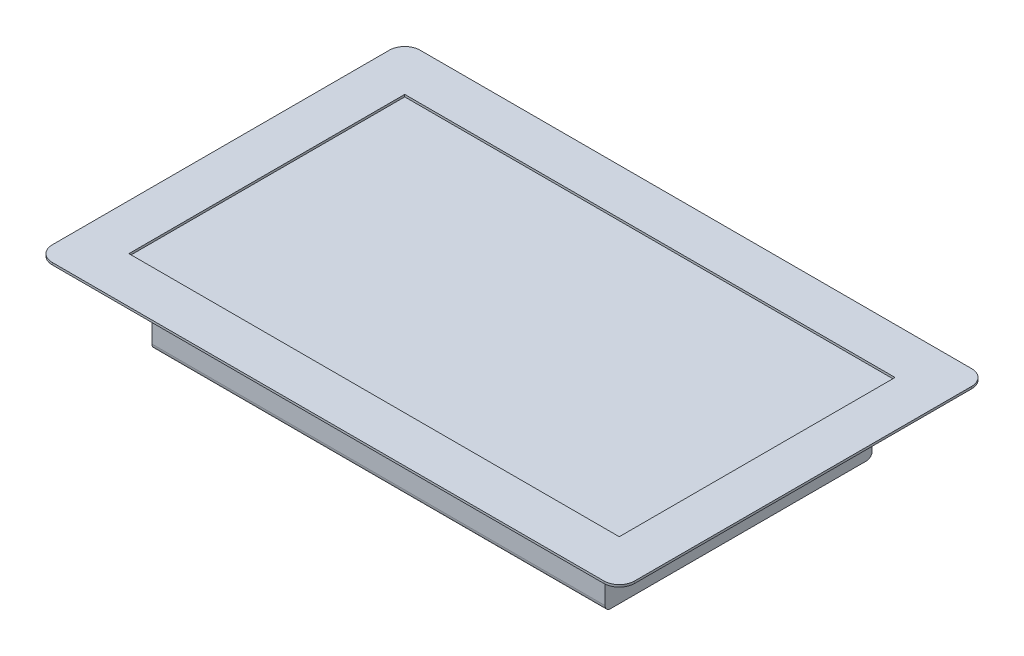
ISO-10303-21;
HEADER;
FILE_DESCRIPTION(('STEP AP214'),'2;1');
FILE_NAME('part.step','',(''),(''),'','','');
FILE_SCHEMA(('AUTOMOTIVE_DESIGN { 1 0 10303 214 1 1 1 1 }'));
ENDSEC;
DATA;
#1=APPLICATION_CONTEXT('core data for automotive mechanical design processes');
#2=APPLICATION_PROTOCOL_DEFINITION('international standard','automotive_design',2000,#1);
#3=PRODUCT_CONTEXT('',#1,'mechanical');
#4=PRODUCT('Part','Part','',(#3));
#5=PRODUCT_RELATED_PRODUCT_CATEGORY('part','',(#4));
#6=PRODUCT_DEFINITION_FORMATION('','',#4);
#7=PRODUCT_DEFINITION_CONTEXT('part definition',#1,'design');
#8=PRODUCT_DEFINITION('design','',#6,#7);
#9=PRODUCT_DEFINITION_SHAPE('','',#8);
#10=(LENGTH_UNIT() NAMED_UNIT(*) SI_UNIT(.MILLI.,.METRE.));
#11=(NAMED_UNIT(*) PLANE_ANGLE_UNIT() SI_UNIT($,.RADIAN.));
#12=(NAMED_UNIT(*) SI_UNIT($,.STERADIAN.) SOLID_ANGLE_UNIT());
#13=UNCERTAINTY_MEASURE_WITH_UNIT(LENGTH_MEASURE(1.E-05),#10,'distance_accuracy_value','');
#14=(GEOMETRIC_REPRESENTATION_CONTEXT(3) GLOBAL_UNCERTAINTY_ASSIGNED_CONTEXT((#13)) GLOBAL_UNIT_ASSIGNED_CONTEXT((#10,
#11,#12)) REPRESENTATION_CONTEXT('',''));
#15=CARTESIAN_POINT('',(0.,0.,0.));
#16=DIRECTION('',(0.,0.,1.));
#17=DIRECTION('',(1.,0.,0.));
#18=AXIS2_PLACEMENT_3D('',#15,#16,#17);
#19=CARTESIAN_POINT('',(0.,-7.,0.));
#20=DIRECTION('',(0.,-1.,0.));
#21=DIRECTION('',(0.,0.,-1.));
#22=AXIS2_PLACEMENT_3D('',#19,#20,#21);
#23=PLANE('',#22);
#24=DIRECTION('',(1.,0.,0.));
#25=VECTOR('',#24,1.);
#26=CARTESIAN_POINT('',(123.5,-7.,74.5));
#27=LINE('',#26,#25);
#28=CARTESIAN_POINT('',(-122.5,-7.,74.5));
#29=VERTEX_POINT('',#28);
#30=CARTESIAN_POINT('',(122.5,-7.,74.5));
#31=VERTEX_POINT('',#30);
#32=EDGE_CURVE('E355',#29,#31,#27,.T.);
#33=ORIENTED_EDGE('',*,*,#32,.F.);
#34=CARTESIAN_POINT('',(-122.5,-7.,73.5));
#35=DIRECTION('',(0.,-1.,0.));
#36=DIRECTION('',(0.,0.,-1.));
#37=AXIS2_PLACEMENT_3D('',#34,#35,#36);
#38=CIRCLE('',#37,1.);
#39=CARTESIAN_POINT('',(-123.5,-7.,73.5));
#40=VERTEX_POINT('',#39);
#41=EDGE_CURVE('E451',#29,#40,#38,.T.);
#42=ORIENTED_EDGE('',*,*,#41,.T.);
#43=DIRECTION('',(0.,0.,1.));
#44=VECTOR('',#43,1.);
#45=CARTESIAN_POINT('',(-123.5,-7.,-74.5));
#46=LINE('',#45,#44);
#47=CARTESIAN_POINT('',(-123.5,-7.,-73.5));
#48=VERTEX_POINT('',#47);
#49=EDGE_CURVE('E352',#48,#40,#46,.T.);
#50=ORIENTED_EDGE('',*,*,#49,.F.);
#51=CARTESIAN_POINT('',(-122.5,-7.,-73.5));
#52=DIRECTION('',(0.,-1.,0.));
#53=DIRECTION('',(0.,0.,-1.));
#54=AXIS2_PLACEMENT_3D('',#51,#52,#53);
#55=CIRCLE('',#54,1.);
#56=CARTESIAN_POINT('',(-122.5,-7.,-74.5));
#57=VERTEX_POINT('',#56);
#58=EDGE_CURVE('E449',#48,#57,#55,.T.);
#59=ORIENTED_EDGE('',*,*,#58,.T.);
#60=DIRECTION('',(-1.,0.,0.));
#61=VECTOR('',#60,1.);
#62=CARTESIAN_POINT('',(123.5,-7.,-74.5));
#63=LINE('',#62,#61);
#64=CARTESIAN_POINT('',(122.5,-7.,-74.5));
#65=VERTEX_POINT('',#64);
#66=EDGE_CURVE('E362',#65,#57,#63,.T.);
#67=ORIENTED_EDGE('',*,*,#66,.F.);
#68=CARTESIAN_POINT('',(122.5,-7.,-73.5));
#69=DIRECTION('',(0.,-1.,0.));
#70=DIRECTION('',(0.,0.,-1.));
#71=AXIS2_PLACEMENT_3D('',#68,#69,#70);
#72=CIRCLE('',#71,1.);
#73=CARTESIAN_POINT('',(123.5,-7.,-73.5));
#74=VERTEX_POINT('',#73);
#75=EDGE_CURVE('E445',#65,#74,#72,.T.);
#76=ORIENTED_EDGE('',*,*,#75,.T.);
#77=DIRECTION('',(0.,0.,-1.));
#78=VECTOR('',#77,1.);
#79=CARTESIAN_POINT('',(123.5,-7.,-74.5));
#80=LINE('',#79,#78);
#81=CARTESIAN_POINT('',(123.5,-7.,73.5));
#82=VERTEX_POINT('',#81);
#83=EDGE_CURVE('E359',#82,#74,#80,.T.);
#84=ORIENTED_EDGE('',*,*,#83,.F.);
#85=CARTESIAN_POINT('',(122.5,-7.,73.5));
#86=DIRECTION('',(0.,-1.,0.));
#87=DIRECTION('',(0.,0.,-1.));
#88=AXIS2_PLACEMENT_3D('',#85,#86,#87);
#89=CIRCLE('',#88,1.);
#90=EDGE_CURVE('E447',#82,#31,#89,.T.);
#91=ORIENTED_EDGE('',*,*,#90,.T.);
#92=EDGE_LOOP('',(#33,#42,#50,#59,#67,#76,#84,#91));
#93=FACE_BOUND('',#92,.T.);
#94=DIRECTION('',(0.,0.,1.));
#95=VECTOR('',#94,1.);
#96=CARTESIAN_POINT('',(103.5,-7.,73.));
#97=LINE('',#96,#95);
#98=CARTESIAN_POINT('',(103.5,-6.99999999999998,-70.5));
#99=VERTEX_POINT('',#98);
#100=CARTESIAN_POINT('',(103.5,-7.,70.5));
#101=VERTEX_POINT('',#100);
#102=EDGE_CURVE('E318',#99,#101,#97,.T.);
#103=ORIENTED_EDGE('',*,*,#102,.F.);
#104=CARTESIAN_POINT('',(101.,-7.,-70.5));
#105=DIRECTION('',(0.,-1.,0.));
#106=DIRECTION('',(0.,0.,-1.));
#107=AXIS2_PLACEMENT_3D('',#104,#105,#106);
#108=CIRCLE('',#107,2.5);
#109=CARTESIAN_POINT('',(101.,-6.99999999999998,-73.));
#110=VERTEX_POINT('',#109);
#111=EDGE_CURVE('E51',#99,#110,#108,.F.);
#112=ORIENTED_EDGE('',*,*,#111,.T.);
#113=DIRECTION('',(-1.,0.,0.));
#114=VECTOR('',#113,1.);
#115=CARTESIAN_POINT('',(103.5,-6.99999999999998,-73.));
#116=LINE('',#115,#114);
#117=CARTESIAN_POINT('',(-101.,-6.99999999999998,-73.));
#118=VERTEX_POINT('',#117);
#119=EDGE_CURVE('E337',#110,#118,#116,.T.);
#120=ORIENTED_EDGE('',*,*,#119,.T.);
#121=CARTESIAN_POINT('',(-101.,-7.,-70.5));
#122=DIRECTION('',(0.,-1.,0.));
#123=DIRECTION('',(0.,0.,-1.));
#124=AXIS2_PLACEMENT_3D('',#121,#122,#123);
#125=CIRCLE('',#124,2.5);
#126=CARTESIAN_POINT('',(-103.5,-6.99999999999998,-70.5));
#127=VERTEX_POINT('',#126);
#128=EDGE_CURVE('E11',#118,#127,#125,.F.);
#129=ORIENTED_EDGE('',*,*,#128,.T.);
#130=DIRECTION('',(0.,0.,1.));
#131=VECTOR('',#130,1.);
#132=CARTESIAN_POINT('',(-103.5,-7.,73.));
#133=LINE('',#132,#131);
#134=CARTESIAN_POINT('',(-103.5,-7.,70.5));
#135=VERTEX_POINT('',#134);
#136=EDGE_CURVE('E307',#127,#135,#133,.T.);
#137=ORIENTED_EDGE('',*,*,#136,.T.);
#138=CARTESIAN_POINT('',(-101.,-7.,70.5));
#139=DIRECTION('',(0.,-1.,0.));
#140=DIRECTION('',(0.,0.,-1.));
#141=AXIS2_PLACEMENT_3D('',#138,#139,#140);
#142=CIRCLE('',#141,2.5);
#143=CARTESIAN_POINT('',(-101.,-7.,73.));
#144=VERTEX_POINT('',#143);
#145=EDGE_CURVE('E516',#135,#144,#142,.F.);
#146=ORIENTED_EDGE('',*,*,#145,.T.);
#147=DIRECTION('',(-1.,0.,0.));
#148=VECTOR('',#147,1.);
#149=CARTESIAN_POINT('',(103.5,-7.,73.));
#150=LINE('',#149,#148);
#151=CARTESIAN_POINT('',(101.,-7.,73.));
#152=VERTEX_POINT('',#151);
#153=EDGE_CURVE('E321',#152,#144,#150,.T.);
#154=ORIENTED_EDGE('',*,*,#153,.F.);
#155=CARTESIAN_POINT('',(101.,-7.,70.5));
#156=DIRECTION('',(0.,-1.,0.));
#157=DIRECTION('',(0.,0.,-1.));
#158=AXIS2_PLACEMENT_3D('',#155,#156,#157);
#159=CIRCLE('',#158,2.5);
#160=EDGE_CURVE('E518',#152,#101,#159,.F.);
#161=ORIENTED_EDGE('',*,*,#160,.T.);
#162=EDGE_LOOP('',(#103,#112,#120,#129,#137,#146,#154,#161));
#163=FACE_BOUND('',#162,.T.);
#164=ADVANCED_FACE('F43',(#93,#163),#23,.T.);
#165=CARTESIAN_POINT('',(-133.,1.,84.));
#166=DIRECTION('',(1.,0.,0.));
#167=DIRECTION('',(0.,0.,-1.));
#168=AXIS2_PLACEMENT_3D('',#165,#166,#167);
#169=PLANE('',#168);
#170=DIRECTION('',(0.,0.,1.));
#171=VECTOR('',#170,1.);
#172=CARTESIAN_POINT('',(-133.,1.,84.));
#173=LINE('',#172,#171);
#174=CARTESIAN_POINT('',(-133.,1.,-77.));
#175=VERTEX_POINT('',#174);
#176=CARTESIAN_POINT('',(-133.,1.,77.));
#177=VERTEX_POINT('',#176);
#178=EDGE_CURVE('E376',#175,#177,#173,.T.);
#179=ORIENTED_EDGE('',*,*,#178,.F.);
#180=DIRECTION('',(0.,-1.,0.));
#181=VECTOR('',#180,1.);
#182=CARTESIAN_POINT('',(-133.,1.,-77.));
#183=LINE('',#182,#181);
#184=CARTESIAN_POINT('',(-133.,0.,-77.));
#185=VERTEX_POINT('',#184);
#186=EDGE_CURVE('E427',#175,#185,#183,.T.);
#187=ORIENTED_EDGE('',*,*,#186,.T.);
#188=DIRECTION('',(0.,0.,1.));
#189=VECTOR('',#188,1.);
#190=CARTESIAN_POINT('',(-133.,0.,84.));
#191=LINE('',#190,#189);
#192=CARTESIAN_POINT('',(-133.,0.,77.));
#193=VERTEX_POINT('',#192);
#194=EDGE_CURVE('E365',#185,#193,#191,.T.);
#195=ORIENTED_EDGE('',*,*,#194,.T.);
#196=DIRECTION('',(0.,-1.,0.));
#197=VECTOR('',#196,1.);
#198=CARTESIAN_POINT('',(-133.,1.,77.));
#199=LINE('',#198,#197);
#200=EDGE_CURVE('E425',#193,#177,#199,.F.);
#201=ORIENTED_EDGE('',*,*,#200,.T.);
#202=EDGE_LOOP('',(#179,#187,#195,#201));
#203=FACE_BOUND('',#202,.T.);
#204=ADVANCED_FACE('F589',(#203),#169,.F.);
#205=CARTESIAN_POINT('',(133.,1.,84.));
#206=DIRECTION('',(0.,0.,-1.));
#207=DIRECTION('',(-1.,0.,0.));
#208=AXIS2_PLACEMENT_3D('',#205,#206,#207);
#209=PLANE('',#208);
#210=DIRECTION('',(1.,0.,0.));
#211=VECTOR('',#210,1.);
#212=CARTESIAN_POINT('',(133.,1.,84.));
#213=LINE('',#212,#211);
#214=CARTESIAN_POINT('',(-126.,1.,84.));
#215=VERTEX_POINT('',#214);
#216=CARTESIAN_POINT('',(126.,1.,84.));
#217=VERTEX_POINT('',#216);
#218=EDGE_CURVE('E379',#215,#217,#213,.T.);
#219=ORIENTED_EDGE('',*,*,#218,.F.);
#220=DIRECTION('',(0.,-1.,0.));
#221=VECTOR('',#220,1.);
#222=CARTESIAN_POINT('',(-126.,1.,84.));
#223=LINE('',#222,#221);
#224=CARTESIAN_POINT('',(-126.,0.,84.));
#225=VERTEX_POINT('',#224);
#226=EDGE_CURVE('E432',#215,#225,#223,.T.);
#227=ORIENTED_EDGE('',*,*,#226,.T.);
#228=DIRECTION('',(1.,0.,0.));
#229=VECTOR('',#228,1.);
#230=CARTESIAN_POINT('',(133.,0.,84.));
#231=LINE('',#230,#229);
#232=CARTESIAN_POINT('',(126.,0.,84.));
#233=VERTEX_POINT('',#232);
#234=EDGE_CURVE('E392',#225,#233,#231,.T.);
#235=ORIENTED_EDGE('',*,*,#234,.T.);
#236=DIRECTION('',(0.,-1.,0.));
#237=VECTOR('',#236,1.);
#238=CARTESIAN_POINT('',(126.,1.,84.));
#239=LINE('',#238,#237);
#240=EDGE_CURVE('E430',#233,#217,#239,.F.);
#241=ORIENTED_EDGE('',*,*,#240,.T.);
#242=EDGE_LOOP('',(#219,#227,#235,#241));
#243=FACE_BOUND('',#242,.T.);
#244=ADVANCED_FACE('F597',(#243),#209,.F.);
#245=CARTESIAN_POINT('',(133.,1.,84.));
#246=DIRECTION('',(-1.,0.,0.));
#247=DIRECTION('',(0.,0.,1.));
#248=AXIS2_PLACEMENT_3D('',#245,#246,#247);
#249=PLANE('',#248);
#250=DIRECTION('',(0.,0.,-1.));
#251=VECTOR('',#250,1.);
#252=CARTESIAN_POINT('',(133.,0.,84.));
#253=LINE('',#252,#251);
#254=CARTESIAN_POINT('',(133.,0.,77.));
#255=VERTEX_POINT('',#254);
#256=CARTESIAN_POINT('',(133.,0.,-77.));
#257=VERTEX_POINT('',#256);
#258=EDGE_CURVE('E395',#255,#257,#253,.T.);
#259=ORIENTED_EDGE('',*,*,#258,.T.);
#260=DIRECTION('',(0.,-1.,0.));
#261=VECTOR('',#260,1.);
#262=CARTESIAN_POINT('',(133.,1.,-77.));
#263=LINE('',#262,#261);
#264=CARTESIAN_POINT('',(133.,1.,-77.));
#265=VERTEX_POINT('',#264);
#266=EDGE_CURVE('E415',#257,#265,#263,.F.);
#267=ORIENTED_EDGE('',*,*,#266,.T.);
#268=DIRECTION('',(0.,0.,-1.));
#269=VECTOR('',#268,1.);
#270=CARTESIAN_POINT('',(133.,1.,84.));
#271=LINE('',#270,#269);
#272=CARTESIAN_POINT('',(133.,1.,77.));
#273=VERTEX_POINT('',#272);
#274=EDGE_CURVE('E383',#273,#265,#271,.T.);
#275=ORIENTED_EDGE('',*,*,#274,.F.);
#276=DIRECTION('',(0.,-1.,0.));
#277=VECTOR('',#276,1.);
#278=CARTESIAN_POINT('',(133.,1.,77.));
#279=LINE('',#278,#277);
#280=EDGE_CURVE('E412',#273,#255,#279,.T.);
#281=ORIENTED_EDGE('',*,*,#280,.T.);
#282=EDGE_LOOP('',(#259,#267,#275,#281));
#283=FACE_BOUND('',#282,.T.);
#284=ADVANCED_FACE('F631',(#283),#249,.F.);
#285=CARTESIAN_POINT('',(133.,1.,-84.));
#286=DIRECTION('',(0.,0.,1.));
#287=DIRECTION('',(1.,0.,0.));
#288=AXIS2_PLACEMENT_3D('',#285,#286,#287);
#289=PLANE('',#288);
#290=DIRECTION('',(-1.,0.,0.));
#291=VECTOR('',#290,1.);
#292=CARTESIAN_POINT('',(133.,1.,-84.));
#293=LINE('',#292,#291);
#294=CARTESIAN_POINT('',(126.,1.,-84.));
#295=VERTEX_POINT('',#294);
#296=CARTESIAN_POINT('',(-126.,1.,-84.));
#297=VERTEX_POINT('',#296);
#298=EDGE_CURVE('E386',#295,#297,#293,.T.);
#299=ORIENTED_EDGE('',*,*,#298,.F.);
#300=DIRECTION('',(0.,-1.,0.));
#301=VECTOR('',#300,1.);
#302=CARTESIAN_POINT('',(126.,1.,-84.));
#303=LINE('',#302,#301);
#304=CARTESIAN_POINT('',(126.,0.,-84.));
#305=VERTEX_POINT('',#304);
#306=EDGE_CURVE('E401',#295,#305,#303,.T.);
#307=ORIENTED_EDGE('',*,*,#306,.T.);
#308=DIRECTION('',(-1.,0.,0.));
#309=VECTOR('',#308,1.);
#310=CARTESIAN_POINT('',(133.,0.,-84.));
#311=LINE('',#310,#309);
#312=CARTESIAN_POINT('',(-126.,0.,-84.));
#313=VERTEX_POINT('',#312);
#314=EDGE_CURVE('E380',#305,#313,#311,.T.);
#315=ORIENTED_EDGE('',*,*,#314,.T.);
#316=DIRECTION('',(0.,-1.,0.));
#317=VECTOR('',#316,1.);
#318=CARTESIAN_POINT('',(-126.,1.,-84.));
#319=LINE('',#318,#317);
#320=EDGE_CURVE('E389',#313,#297,#319,.F.);
#321=ORIENTED_EDGE('',*,*,#320,.T.);
#322=EDGE_LOOP('',(#299,#307,#315,#321));
#323=FACE_BOUND('',#322,.T.);
#324=ADVANCED_FACE('F624',(#323),#289,.F.);
#325=CARTESIAN_POINT('',(0.,1.,0.));
#326=DIRECTION('',(0.,1.,0.));
#327=DIRECTION('',(0.,0.,1.));
#328=AXIS2_PLACEMENT_3D('',#325,#326,#327);
#329=PLANE('',#328);
#330=DIRECTION('',(0.,0.,1.));
#331=VECTOR('',#330,1.);
#332=CARTESIAN_POINT('',(-112.,1.,63.));
#333=LINE('',#332,#331);
#334=CARTESIAN_POINT('',(-112.,1.,-63.));
#335=VERTEX_POINT('',#334);
#336=CARTESIAN_POINT('',(-112.,1.,63.));
#337=VERTEX_POINT('',#336);
#338=EDGE_CURVE('E58',#335,#337,#333,.T.);
#339=ORIENTED_EDGE('',*,*,#338,.F.);
#340=DIRECTION('',(-1.,0.,0.));
#341=VECTOR('',#340,1.);
#342=CARTESIAN_POINT('',(112.,1.,-63.));
#343=LINE('',#342,#341);
#344=CARTESIAN_POINT('',(112.,1.,-63.));
#345=VERTEX_POINT('',#344);
#346=EDGE_CURVE('E285',#345,#335,#343,.T.);
#347=ORIENTED_EDGE('',*,*,#346,.F.);
#348=DIRECTION('',(0.,0.,-1.));
#349=VECTOR('',#348,1.);
#350=CARTESIAN_POINT('',(112.,1.,63.));
#351=LINE('',#350,#349);
#352=CARTESIAN_POINT('',(112.,1.,63.));
#353=VERTEX_POINT('',#352);
#354=EDGE_CURVE('E288',#353,#345,#351,.T.);
#355=ORIENTED_EDGE('',*,*,#354,.F.);
#356=DIRECTION('',(1.,0.,0.));
#357=VECTOR('',#356,1.);
#358=CARTESIAN_POINT('',(112.,1.,63.));
#359=LINE('',#358,#357);
#360=EDGE_CURVE('E294',#337,#353,#359,.T.);
#361=ORIENTED_EDGE('',*,*,#360,.F.);
#362=EDGE_LOOP('',(#339,#347,#355,#361));
#363=FACE_BOUND('',#362,.T.);
#364=ORIENTED_EDGE('',*,*,#274,.T.);
#365=CARTESIAN_POINT('',(126.,1.,-77.));
#366=DIRECTION('',(0.,1.,0.));
#367=DIRECTION('',(0.,0.,1.));
#368=AXIS2_PLACEMENT_3D('',#365,#366,#367);
#369=CIRCLE('',#368,7.);
#370=EDGE_CURVE('E423',#265,#295,#369,.T.);
#371=ORIENTED_EDGE('',*,*,#370,.T.);
#372=ORIENTED_EDGE('',*,*,#298,.T.);
#373=CARTESIAN_POINT('',(-126.,1.,-77.));
#374=DIRECTION('',(0.,1.,0.));
#375=DIRECTION('',(0.,0.,1.));
#376=AXIS2_PLACEMENT_3D('',#373,#374,#375);
#377=CIRCLE('',#376,7.);
#378=EDGE_CURVE('E421',#297,#175,#377,.T.);
#379=ORIENTED_EDGE('',*,*,#378,.T.);
#380=ORIENTED_EDGE('',*,*,#178,.T.);
#381=CARTESIAN_POINT('',(-126.,1.,77.));
#382=DIRECTION('',(0.,1.,0.));
#383=DIRECTION('',(0.,0.,1.));
#384=AXIS2_PLACEMENT_3D('',#381,#382,#383);
#385=CIRCLE('',#384,7.);
#386=EDGE_CURVE('E419',#177,#215,#385,.T.);
#387=ORIENTED_EDGE('',*,*,#386,.T.);
#388=ORIENTED_EDGE('',*,*,#218,.T.);
#389=CARTESIAN_POINT('',(126.,1.,77.));
#390=DIRECTION('',(0.,1.,0.));
#391=DIRECTION('',(0.,0.,1.));
#392=AXIS2_PLACEMENT_3D('',#389,#390,#391);
#393=CIRCLE('',#392,7.);
#394=EDGE_CURVE('E417',#217,#273,#393,.T.);
#395=ORIENTED_EDGE('',*,*,#394,.T.);
#396=EDGE_LOOP('',(#364,#371,#372,#379,#380,#387,#388,#395));
#397=FACE_BOUND('',#396,.T.);
#398=ADVANCED_FACE('F621',(#363,#397),#329,.T.);
#399=CARTESIAN_POINT('',(0.,0.,0.));
#400=DIRECTION('',(0.,1.,0.));
#401=DIRECTION('',(0.,0.,1.));
#402=AXIS2_PLACEMENT_3D('',#399,#400,#401);
#403=PLANE('',#402);
#404=DIRECTION('',(0.,0.,-1.));
#405=VECTOR('',#404,1.);
#406=CARTESIAN_POINT('',(123.5,0.,-74.5));
#407=LINE('',#406,#405);
#408=CARTESIAN_POINT('',(123.5,0.,73.5));
#409=VERTEX_POINT('',#408);
#410=CARTESIAN_POINT('',(123.5,0.,-73.5));
#411=VERTEX_POINT('',#410);
#412=EDGE_CURVE('E371',#409,#411,#407,.T.);
#413=ORIENTED_EDGE('',*,*,#412,.T.);
#414=CARTESIAN_POINT('',(122.5,0.,-73.5));
#415=DIRECTION('',(0.,1.,0.));
#416=DIRECTION('',(0.,0.,1.));
#417=AXIS2_PLACEMENT_3D('',#414,#415,#416);
#418=CIRCLE('',#417,1.);
#419=CARTESIAN_POINT('',(122.5,0.,-74.5));
#420=VERTEX_POINT('',#419);
#421=EDGE_CURVE('E469',#411,#420,#418,.T.);
#422=ORIENTED_EDGE('',*,*,#421,.T.);
#423=DIRECTION('',(-1.,0.,0.));
#424=VECTOR('',#423,1.);
#425=CARTESIAN_POINT('',(123.5,0.,-74.5));
#426=LINE('',#425,#424);
#427=CARTESIAN_POINT('',(-122.5,0.,-74.5));
#428=VERTEX_POINT('',#427);
#429=EDGE_CURVE('E356',#420,#428,#426,.T.);
#430=ORIENTED_EDGE('',*,*,#429,.T.);
#431=CARTESIAN_POINT('',(-122.5,0.,-73.5));
#432=DIRECTION('',(0.,1.,0.));
#433=DIRECTION('',(0.,0.,1.));
#434=AXIS2_PLACEMENT_3D('',#431,#432,#433);
#435=CIRCLE('',#434,1.);
#436=CARTESIAN_POINT('',(-123.5,0.,-73.5));
#437=VERTEX_POINT('',#436);
#438=EDGE_CURVE('E465',#428,#437,#435,.T.);
#439=ORIENTED_EDGE('',*,*,#438,.T.);
#440=DIRECTION('',(0.,0.,1.));
#441=VECTOR('',#440,1.);
#442=CARTESIAN_POINT('',(-123.5,0.,-74.5));
#443=LINE('',#442,#441);
#444=CARTESIAN_POINT('',(-123.5,0.,73.5));
#445=VERTEX_POINT('',#444);
#446=EDGE_CURVE('E351',#437,#445,#443,.T.);
#447=ORIENTED_EDGE('',*,*,#446,.T.);
#448=CARTESIAN_POINT('',(-122.5,0.,73.5));
#449=DIRECTION('',(0.,1.,0.));
#450=DIRECTION('',(0.,0.,1.));
#451=AXIS2_PLACEMENT_3D('',#448,#449,#450);
#452=CIRCLE('',#451,1.);
#453=CARTESIAN_POINT('',(-122.5,0.,74.5));
#454=VERTEX_POINT('',#453);
#455=EDGE_CURVE('E463',#445,#454,#452,.T.);
#456=ORIENTED_EDGE('',*,*,#455,.T.);
#457=DIRECTION('',(1.,0.,0.));
#458=VECTOR('',#457,1.);
#459=CARTESIAN_POINT('',(123.5,0.,74.5));
#460=LINE('',#459,#458);
#461=CARTESIAN_POINT('',(122.5,0.,74.5));
#462=VERTEX_POINT('',#461);
#463=EDGE_CURVE('E368',#454,#462,#460,.T.);
#464=ORIENTED_EDGE('',*,*,#463,.T.);
#465=CARTESIAN_POINT('',(122.5,0.,73.5));
#466=DIRECTION('',(0.,1.,0.));
#467=DIRECTION('',(0.,0.,1.));
#468=AXIS2_PLACEMENT_3D('',#465,#466,#467);
#469=CIRCLE('',#468,1.);
#470=EDGE_CURVE('E467',#462,#409,#469,.T.);
#471=ORIENTED_EDGE('',*,*,#470,.T.);
#472=EDGE_LOOP('',(#413,#422,#430,#439,#447,#456,#464,#471));
#473=FACE_BOUND('',#472,.T.);
#474=ORIENTED_EDGE('',*,*,#314,.F.);
#475=CARTESIAN_POINT('',(126.,0.,-77.));
#476=DIRECTION('',(0.,1.,0.));
#477=DIRECTION('',(0.,0.,1.));
#478=AXIS2_PLACEMENT_3D('',#475,#476,#477);
#479=CIRCLE('',#478,7.);
#480=EDGE_CURVE('E410',#305,#257,#479,.F.);
#481=ORIENTED_EDGE('',*,*,#480,.T.);
#482=ORIENTED_EDGE('',*,*,#258,.F.);
#483=CARTESIAN_POINT('',(126.,0.,77.));
#484=DIRECTION('',(0.,1.,0.));
#485=DIRECTION('',(0.,0.,1.));
#486=AXIS2_PLACEMENT_3D('',#483,#484,#485);
#487=CIRCLE('',#486,7.);
#488=EDGE_CURVE('E404',#255,#233,#487,.F.);
#489=ORIENTED_EDGE('',*,*,#488,.T.);
#490=ORIENTED_EDGE('',*,*,#234,.F.);
#491=CARTESIAN_POINT('',(-126.,0.,77.));
#492=DIRECTION('',(0.,1.,0.));
#493=DIRECTION('',(0.,0.,1.));
#494=AXIS2_PLACEMENT_3D('',#491,#492,#493);
#495=CIRCLE('',#494,7.);
#496=EDGE_CURVE('E406',#225,#193,#495,.F.);
#497=ORIENTED_EDGE('',*,*,#496,.T.);
#498=ORIENTED_EDGE('',*,*,#194,.F.);
#499=CARTESIAN_POINT('',(-126.,0.,-77.));
#500=DIRECTION('',(0.,1.,0.));
#501=DIRECTION('',(0.,0.,1.));
#502=AXIS2_PLACEMENT_3D('',#499,#500,#501);
#503=CIRCLE('',#502,7.);
#504=EDGE_CURVE('E408',#185,#313,#503,.F.);
#505=ORIENTED_EDGE('',*,*,#504,.T.);
#506=EDGE_LOOP('',(#474,#481,#482,#489,#490,#497,#498,#505));
#507=FACE_BOUND('',#506,.T.);
#508=ADVANCED_FACE('F619',(#473,#507),#403,.F.);
#509=CARTESIAN_POINT('',(-123.5,-7.,-74.5));
#510=DIRECTION('',(-1.,0.,0.));
#511=DIRECTION('',(0.,0.,1.));
#512=AXIS2_PLACEMENT_3D('',#509,#510,#511);
#513=PLANE('',#512);
#514=ORIENTED_EDGE('',*,*,#49,.T.);
#515=DIRECTION('',(0.,1.,0.));
#516=VECTOR('',#515,1.);
#517=CARTESIAN_POINT('',(-123.5,-7.,73.5));
#518=LINE('',#517,#516);
#519=EDGE_CURVE('E437',#40,#445,#518,.T.);
#520=ORIENTED_EDGE('',*,*,#519,.T.);
#521=ORIENTED_EDGE('',*,*,#446,.F.);
#522=DIRECTION('',(0.,1.,0.));
#523=VECTOR('',#522,1.);
#524=CARTESIAN_POINT('',(-123.5,-7.,-73.5));
#525=LINE('',#524,#523);
#526=EDGE_CURVE('E435',#437,#48,#525,.F.);
#527=ORIENTED_EDGE('',*,*,#526,.T.);
#528=EDGE_LOOP('',(#514,#520,#521,#527));
#529=FACE_BOUND('',#528,.T.);
#530=ADVANCED_FACE('F608',(#529),#513,.T.);
#531=CARTESIAN_POINT('',(123.5,-7.,-74.5));
#532=DIRECTION('',(0.,0.,-1.));
#533=DIRECTION('',(-1.,0.,0.));
#534=AXIS2_PLACEMENT_3D('',#531,#532,#533);
#535=PLANE('',#534);
#536=ORIENTED_EDGE('',*,*,#66,.T.);
#537=DIRECTION('',(0.,1.,0.));
#538=VECTOR('',#537,1.);
#539=CARTESIAN_POINT('',(-122.5,-7.,-74.5));
#540=LINE('',#539,#538);
#541=EDGE_CURVE('E455',#57,#428,#540,.T.);
#542=ORIENTED_EDGE('',*,*,#541,.T.);
#543=ORIENTED_EDGE('',*,*,#429,.F.);
#544=DIRECTION('',(0.,1.,0.));
#545=VECTOR('',#544,1.);
#546=CARTESIAN_POINT('',(122.5,-7.,-74.5));
#547=LINE('',#546,#545);
#548=EDGE_CURVE('E453',#420,#65,#547,.F.);
#549=ORIENTED_EDGE('',*,*,#548,.T.);
#550=EDGE_LOOP('',(#536,#542,#543,#549));
#551=FACE_BOUND('',#550,.T.);
#552=ADVANCED_FACE('F604',(#551),#535,.T.);
#553=CARTESIAN_POINT('',(123.5,-7.,-74.5));
#554=DIRECTION('',(1.,0.,0.));
#555=DIRECTION('',(0.,0.,-1.));
#556=AXIS2_PLACEMENT_3D('',#553,#554,#555);
#557=PLANE('',#556);
#558=ORIENTED_EDGE('',*,*,#412,.F.);
#559=DIRECTION('',(0.,1.,0.));
#560=VECTOR('',#559,1.);
#561=CARTESIAN_POINT('',(123.5,-7.,73.5));
#562=LINE('',#561,#560);
#563=EDGE_CURVE('E461',#409,#82,#562,.F.);
#564=ORIENTED_EDGE('',*,*,#563,.T.);
#565=ORIENTED_EDGE('',*,*,#83,.T.);
#566=DIRECTION('',(0.,1.,0.));
#567=VECTOR('',#566,1.);
#568=CARTESIAN_POINT('',(123.5,-7.,-73.5));
#569=LINE('',#568,#567);
#570=EDGE_CURVE('E458',#74,#411,#569,.T.);
#571=ORIENTED_EDGE('',*,*,#570,.T.);
#572=EDGE_LOOP('',(#558,#564,#565,#571));
#573=FACE_BOUND('',#572,.T.);
#574=ADVANCED_FACE('F607',(#573),#557,.T.);
#575=CARTESIAN_POINT('',(123.5,-7.,74.5));
#576=DIRECTION('',(0.,0.,1.));
#577=DIRECTION('',(1.,0.,0.));
#578=AXIS2_PLACEMENT_3D('',#575,#576,#577);
#579=PLANE('',#578);
#580=ORIENTED_EDGE('',*,*,#463,.F.);
#581=DIRECTION('',(0.,1.,0.));
#582=VECTOR('',#581,1.);
#583=CARTESIAN_POINT('',(-122.5,-7.,74.5));
#584=LINE('',#583,#582);
#585=EDGE_CURVE('E443',#454,#29,#584,.F.);
#586=ORIENTED_EDGE('',*,*,#585,.T.);
#587=ORIENTED_EDGE('',*,*,#32,.T.);
#588=DIRECTION('',(0.,1.,0.));
#589=VECTOR('',#588,1.);
#590=CARTESIAN_POINT('',(122.5,-7.,74.5));
#591=LINE('',#590,#589);
#592=EDGE_CURVE('E440',#31,#462,#591,.T.);
#593=ORIENTED_EDGE('',*,*,#592,.T.);
#594=EDGE_LOOP('',(#580,#586,#587,#593));
#595=FACE_BOUND('',#594,.T.);
#596=ADVANCED_FACE('F612',(#595),#579,.T.);
#597=CARTESIAN_POINT('',(103.5,-8.,73.));
#598=DIRECTION('',(0.,0.,-1.));
#599=DIRECTION('',(-1.,0.,0.));
#600=AXIS2_PLACEMENT_3D('',#597,#598,#599);
#601=PLANE('',#600);
#602=ORIENTED_EDGE('',*,*,#153,.T.);
#603=DIRECTION('',(0.,-1.,0.));
#604=VECTOR('',#603,1.);
#605=CARTESIAN_POINT('',(-101.,-8.,73.));
#606=LINE('',#605,#604);
#607=CARTESIAN_POINT('',(-101.,-8.,73.));
#608=VERTEX_POINT('',#607);
#609=EDGE_CURVE('E473',#144,#608,#606,.T.);
#610=ORIENTED_EDGE('',*,*,#609,.T.);
#611=DIRECTION('',(-1.,0.,0.));
#612=VECTOR('',#611,1.);
#613=CARTESIAN_POINT('',(103.5,-8.,73.));
#614=LINE('',#613,#612);
#615=CARTESIAN_POINT('',(101.,-8.,73.));
#616=VERTEX_POINT('',#615);
#617=EDGE_CURVE('E348',#616,#608,#614,.T.);
#618=ORIENTED_EDGE('',*,*,#617,.F.);
#619=DIRECTION('',(0.,-1.,0.));
#620=VECTOR('',#619,1.);
#621=CARTESIAN_POINT('',(101.,-8.,73.));
#622=LINE('',#621,#620);
#623=EDGE_CURVE('E471',#616,#152,#622,.F.);
#624=ORIENTED_EDGE('',*,*,#623,.T.);
#625=EDGE_LOOP('',(#602,#610,#618,#624));
#626=FACE_BOUND('',#625,.T.);
#627=ADVANCED_FACE('F557',(#626),#601,.F.);
#628=CARTESIAN_POINT('',(103.5,-8.,61.));
#629=DIRECTION('',(0.,1.,0.));
#630=DIRECTION('',(0.,0.,1.));
#631=AXIS2_PLACEMENT_3D('',#628,#629,#630);
#632=PLANE('',#631);
#633=ORIENTED_EDGE('',*,*,#617,.T.);
#634=CARTESIAN_POINT('',(-101.,-8.,70.5));
#635=DIRECTION('',(0.,1.,0.));
#636=DIRECTION('',(0.,0.,1.));
#637=AXIS2_PLACEMENT_3D('',#634,#635,#636);
#638=CIRCLE('',#637,2.5);
#639=CARTESIAN_POINT('',(-103.5,-8.,70.5));
#640=VERTEX_POINT('',#639);
#641=EDGE_CURVE('E478',#608,#640,#638,.F.);
#642=ORIENTED_EDGE('',*,*,#641,.T.);
#643=DIRECTION('',(0.,0.,-1.));
#644=VECTOR('',#643,1.);
#645=CARTESIAN_POINT('',(-103.5,-8.,61.));
#646=LINE('',#645,#644);
#647=CARTESIAN_POINT('',(-103.5,-8.,61.));
#648=VERTEX_POINT('',#647);
#649=EDGE_CURVE('E300',#640,#648,#646,.T.);
#650=ORIENTED_EDGE('',*,*,#649,.T.);
#651=DIRECTION('',(-1.,0.,0.));
#652=VECTOR('',#651,1.);
#653=CARTESIAN_POINT('',(103.5,-8.,61.));
#654=LINE('',#653,#652);
#655=CARTESIAN_POINT('',(103.5,-8.,61.));
#656=VERTEX_POINT('',#655);
#657=EDGE_CURVE('E345',#656,#648,#654,.T.);
#658=ORIENTED_EDGE('',*,*,#657,.F.);
#659=DIRECTION('',(0.,0.,-1.));
#660=VECTOR('',#659,1.);
#661=CARTESIAN_POINT('',(103.5,-8.,61.));
#662=LINE('',#661,#660);
#663=CARTESIAN_POINT('',(103.5,-8.,70.5));
#664=VERTEX_POINT('',#663);
#665=EDGE_CURVE('E304',#664,#656,#662,.T.);
#666=ORIENTED_EDGE('',*,*,#665,.F.);
#667=CARTESIAN_POINT('',(101.,-8.,70.5));
#668=DIRECTION('',(0.,1.,0.));
#669=DIRECTION('',(0.,0.,1.));
#670=AXIS2_PLACEMENT_3D('',#667,#668,#669);
#671=CIRCLE('',#670,2.5);
#672=EDGE_CURVE('E476',#664,#616,#671,.F.);
#673=ORIENTED_EDGE('',*,*,#672,.T.);
#674=EDGE_LOOP('',(#633,#642,#650,#658,#666,#673));
#675=FACE_BOUND('',#674,.T.);
#676=ADVANCED_FACE('F560',(#675),#632,.F.);
#677=CARTESIAN_POINT('',(103.5,-34.,61.));
#678=DIRECTION('',(0.,0.,-1.));
#679=DIRECTION('',(0.,1.,0.));
#680=AXIS2_PLACEMENT_3D('',#677,#678,#679);
#681=PLANE('',#680);
#682=DIRECTION('',(0.,-1.,0.));
#683=VECTOR('',#682,1.);
#684=CARTESIAN_POINT('',(-103.5,-34.,61.));
#685=LINE('',#684,#683);
#686=CARTESIAN_POINT('',(-103.5,-31.5,61.));
#687=VERTEX_POINT('',#686);
#688=EDGE_CURVE('E323',#648,#687,#685,.T.);
#689=ORIENTED_EDGE('',*,*,#688,.T.);
#690=DIRECTION('',(-1.,0.,0.));
#691=VECTOR('',#690,1.);
#692=CARTESIAN_POINT('',(103.5,-31.5,61.));
#693=LINE('',#692,#691);
#694=CARTESIAN_POINT('',(103.5,-31.5,61.));
#695=VERTEX_POINT('',#694);
#696=EDGE_CURVE('E514',#687,#695,#693,.F.);
#697=ORIENTED_EDGE('',*,*,#696,.T.);
#698=DIRECTION('',(0.,-1.,0.));
#699=VECTOR('',#698,1.);
#700=CARTESIAN_POINT('',(103.5,-34.,61.));
#701=LINE('',#700,#699);
#702=EDGE_CURVE('E306',#656,#695,#701,.T.);
#703=ORIENTED_EDGE('',*,*,#702,.F.);
#704=ORIENTED_EDGE('',*,*,#657,.T.);
#705=EDGE_LOOP('',(#689,#697,#703,#704));
#706=FACE_BOUND('',#705,.T.);
#707=ADVANCED_FACE('F571',(#706),#681,.F.);
#708=CARTESIAN_POINT('',(103.5,-34.,-61.));
#709=DIRECTION('',(0.,1.,0.));
#710=DIRECTION('',(0.,0.,1.));
#711=AXIS2_PLACEMENT_3D('',#708,#709,#710);
#712=PLANE('',#711);
#713=DIRECTION('',(0.,0.,-1.));
#714=VECTOR('',#713,1.);
#715=CARTESIAN_POINT('',(-103.5,-34.,-61.));
#716=LINE('',#715,#714);
#717=CARTESIAN_POINT('',(-103.5,-34.,58.5));
#718=VERTEX_POINT('',#717);
#719=CARTESIAN_POINT('',(-103.5,-34.,-58.5));
#720=VERTEX_POINT('',#719);
#721=EDGE_CURVE('E326',#718,#720,#716,.T.);
#722=ORIENTED_EDGE('',*,*,#721,.T.);
#723=DIRECTION('',(-1.,0.,0.));
#724=VECTOR('',#723,1.);
#725=CARTESIAN_POINT('',(103.5,-34.,-58.5));
#726=LINE('',#725,#724);
#727=CARTESIAN_POINT('',(103.5,-34.,-58.5));
#728=VERTEX_POINT('',#727);
#729=EDGE_CURVE('E512',#720,#728,#726,.F.);
#730=ORIENTED_EDGE('',*,*,#729,.T.);
#731=DIRECTION('',(0.,0.,-1.));
#732=VECTOR('',#731,1.);
#733=CARTESIAN_POINT('',(103.5,-34.,-61.));
#734=LINE('',#733,#732);
#735=CARTESIAN_POINT('',(103.5,-34.,58.5));
#736=VERTEX_POINT('',#735);
#737=EDGE_CURVE('E310',#736,#728,#734,.T.);
#738=ORIENTED_EDGE('',*,*,#737,.F.);
#739=DIRECTION('',(-1.,0.,0.));
#740=VECTOR('',#739,1.);
#741=CARTESIAN_POINT('',(103.5,-34.,58.5));
#742=LINE('',#741,#740);
#743=EDGE_CURVE('E509',#736,#718,#742,.T.);
#744=ORIENTED_EDGE('',*,*,#743,.T.);
#745=EDGE_LOOP('',(#722,#730,#738,#744));
#746=FACE_BOUND('',#745,.T.);
#747=ADVANCED_FACE('F577',(#746),#712,.F.);
#748=CARTESIAN_POINT('',(103.5,-7.99999999999996,-61.));
#749=DIRECTION('',(0.,0.,1.));
#750=DIRECTION('',(0.,-1.,0.));
#751=AXIS2_PLACEMENT_3D('',#748,#749,#750);
#752=PLANE('',#751);
#753=DIRECTION('',(0.,1.,0.));
#754=VECTOR('',#753,1.);
#755=CARTESIAN_POINT('',(103.5,-7.99999999999996,-61.));
#756=LINE('',#755,#754);
#757=CARTESIAN_POINT('',(103.5,-31.5,-61.));
#758=VERTEX_POINT('',#757);
#759=CARTESIAN_POINT('',(103.5,-7.99999999999996,-61.));
#760=VERTEX_POINT('',#759);
#761=EDGE_CURVE('E313',#758,#760,#756,.T.);
#762=ORIENTED_EDGE('',*,*,#761,.F.);
#763=DIRECTION('',(-1.,0.,0.));
#764=VECTOR('',#763,1.);
#765=CARTESIAN_POINT('',(103.5,-31.5,-61.));
#766=LINE('',#765,#764);
#767=CARTESIAN_POINT('',(-103.5,-31.5,-61.));
#768=VERTEX_POINT('',#767);
#769=EDGE_CURVE('E506',#758,#768,#766,.T.);
#770=ORIENTED_EDGE('',*,*,#769,.T.);
#771=DIRECTION('',(0.,1.,0.));
#772=VECTOR('',#771,1.);
#773=CARTESIAN_POINT('',(-103.5,-7.99999999999996,-61.));
#774=LINE('',#773,#772);
#775=CARTESIAN_POINT('',(-103.5,-7.99999999999996,-61.));
#776=VERTEX_POINT('',#775);
#777=EDGE_CURVE('E329',#768,#776,#774,.T.);
#778=ORIENTED_EDGE('',*,*,#777,.T.);
#779=DIRECTION('',(-1.,0.,0.));
#780=VECTOR('',#779,1.);
#781=CARTESIAN_POINT('',(103.5,-7.99999999999996,-61.));
#782=LINE('',#781,#780);
#783=EDGE_CURVE('E342',#760,#776,#782,.T.);
#784=ORIENTED_EDGE('',*,*,#783,.F.);
#785=EDGE_LOOP('',(#762,#770,#778,#784));
#786=FACE_BOUND('',#785,.T.);
#787=ADVANCED_FACE('F539',(#786),#752,.F.);
#788=CARTESIAN_POINT('',(103.5,-7.99999999999998,-73.));
#789=DIRECTION('',(0.,1.,0.));
#790=DIRECTION('',(0.,0.,1.));
#791=AXIS2_PLACEMENT_3D('',#788,#789,#790);
#792=PLANE('',#791);
#793=DIRECTION('',(-1.,0.,0.));
#794=VECTOR('',#793,1.);
#795=CARTESIAN_POINT('',(103.5,-7.99999999999998,-73.));
#796=LINE('',#795,#794);
#797=CARTESIAN_POINT('',(101.,-7.99999999999998,-73.));
#798=VERTEX_POINT('',#797);
#799=CARTESIAN_POINT('',(-101.,-7.99999999999998,-73.));
#800=VERTEX_POINT('',#799);
#801=EDGE_CURVE('E340',#798,#800,#796,.T.);
#802=ORIENTED_EDGE('',*,*,#801,.F.);
#803=CARTESIAN_POINT('',(101.,-7.99999999999997,-70.5));
#804=DIRECTION('',(0.,1.,0.));
#805=DIRECTION('',(0.,0.,1.));
#806=AXIS2_PLACEMENT_3D('',#803,#804,#805);
#807=CIRCLE('',#806,2.5);
#808=CARTESIAN_POINT('',(103.5,-7.99999999999997,-70.5));
#809=VERTEX_POINT('',#808);
#810=EDGE_CURVE('E504',#798,#809,#807,.F.);
#811=ORIENTED_EDGE('',*,*,#810,.T.);
#812=DIRECTION('',(0.,0.,-1.));
#813=VECTOR('',#812,1.);
#814=CARTESIAN_POINT('',(103.5,-7.99999999999998,-73.));
#815=LINE('',#814,#813);
#816=EDGE_CURVE('E315',#760,#809,#815,.T.);
#817=ORIENTED_EDGE('',*,*,#816,.F.);
#818=ORIENTED_EDGE('',*,*,#783,.T.);
#819=DIRECTION('',(0.,0.,-1.));
#820=VECTOR('',#819,1.);
#821=CARTESIAN_POINT('',(-103.5,-7.99999999999998,-73.));
#822=LINE('',#821,#820);
#823=CARTESIAN_POINT('',(-103.5,-7.99999999999997,-70.5));
#824=VERTEX_POINT('',#823);
#825=EDGE_CURVE('E331',#776,#824,#822,.T.);
#826=ORIENTED_EDGE('',*,*,#825,.T.);
#827=CARTESIAN_POINT('',(-101.,-7.99999999999997,-70.5));
#828=DIRECTION('',(0.,1.,0.));
#829=DIRECTION('',(0.,0.,1.));
#830=AXIS2_PLACEMENT_3D('',#827,#828,#829);
#831=CIRCLE('',#830,2.5);
#832=EDGE_CURVE('E66',#824,#800,#831,.F.);
#833=ORIENTED_EDGE('',*,*,#832,.T.);
#834=EDGE_LOOP('',(#802,#811,#817,#818,#826,#833));
#835=FACE_BOUND('',#834,.T.);
#836=ADVANCED_FACE('F531',(#835),#792,.F.);
#837=CARTESIAN_POINT('',(103.5,-6.99999999999998,-73.));
#838=DIRECTION('',(0.,0.,1.));
#839=DIRECTION('',(1.,0.,0.));
#840=AXIS2_PLACEMENT_3D('',#837,#838,#839);
#841=PLANE('',#840);
#842=ORIENTED_EDGE('',*,*,#119,.F.);
#843=DIRECTION('',(0.,1.,0.));
#844=VECTOR('',#843,1.);
#845=CARTESIAN_POINT('',(101.,-6.99999999999998,-73.));
#846=LINE('',#845,#844);
#847=EDGE_CURVE('E501',#110,#798,#846,.F.);
#848=ORIENTED_EDGE('',*,*,#847,.T.);
#849=ORIENTED_EDGE('',*,*,#801,.T.);
#850=DIRECTION('',(0.,1.,0.));
#851=VECTOR('',#850,1.);
#852=CARTESIAN_POINT('',(-101.,-6.99999999999998,-73.));
#853=LINE('',#852,#851);
#854=EDGE_CURVE('E498',#800,#118,#853,.T.);
#855=ORIENTED_EDGE('',*,*,#854,.T.);
#856=EDGE_LOOP('',(#842,#848,#849,#855));
#857=FACE_BOUND('',#856,.T.);
#858=ADVANCED_FACE('F526',(#857),#841,.F.);
#859=CARTESIAN_POINT('',(103.5,0.,0.));
#860=DIRECTION('',(-1.,0.,0.));
#861=DIRECTION('',(0.,0.,1.));
#862=AXIS2_PLACEMENT_3D('',#859,#860,#861);
#863=PLANE('',#862);
#864=ORIENTED_EDGE('',*,*,#102,.T.);
#865=DIRECTION('',(0.,-1.,0.));
#866=VECTOR('',#865,1.);
#867=CARTESIAN_POINT('',(103.5,0.,70.5));
#868=LINE('',#867,#866);
#869=EDGE_CURVE('E495',#101,#664,#868,.T.);
#870=ORIENTED_EDGE('',*,*,#869,.T.);
#871=ORIENTED_EDGE('',*,*,#665,.T.);
#872=ORIENTED_EDGE('',*,*,#702,.T.);
#873=CARTESIAN_POINT('',(103.5,-31.5,58.5));
#874=DIRECTION('',(-1.,0.,0.));
#875=DIRECTION('',(0.,0.,1.));
#876=AXIS2_PLACEMENT_3D('',#873,#874,#875);
#877=CIRCLE('',#876,2.5);
#878=EDGE_CURVE('E488',#695,#736,#877,.F.);
#879=ORIENTED_EDGE('',*,*,#878,.T.);
#880=ORIENTED_EDGE('',*,*,#737,.T.);
#881=CARTESIAN_POINT('',(103.5,-31.5,-58.5));
#882=DIRECTION('',(-1.,0.,0.));
#883=DIRECTION('',(0.,0.,1.));
#884=AXIS2_PLACEMENT_3D('',#881,#882,#883);
#885=CIRCLE('',#884,2.5);
#886=EDGE_CURVE('E490',#728,#758,#885,.F.);
#887=ORIENTED_EDGE('',*,*,#886,.T.);
#888=ORIENTED_EDGE('',*,*,#761,.T.);
#889=ORIENTED_EDGE('',*,*,#816,.T.);
#890=DIRECTION('',(0.,1.,0.));
#891=VECTOR('',#890,1.);
#892=CARTESIAN_POINT('',(103.5,0.,-70.5));
#893=LINE('',#892,#891);
#894=EDGE_CURVE('E492',#809,#99,#893,.T.);
#895=ORIENTED_EDGE('',*,*,#894,.T.);
#896=EDGE_LOOP('',(#864,#870,#871,#872,#879,#880,#887,#888,#889,#895));
#897=FACE_BOUND('',#896,.T.);
#898=ADVANCED_FACE('F533',(#897),#863,.F.);
#899=CARTESIAN_POINT('',(-103.5,0.,0.));
#900=DIRECTION('',(-1.,0.,0.));
#901=DIRECTION('',(0.,0.,1.));
#902=AXIS2_PLACEMENT_3D('',#899,#900,#901);
#903=PLANE('',#902);
#904=ORIENTED_EDGE('',*,*,#649,.F.);
#905=DIRECTION('',(0.,-1.,0.));
#906=VECTOR('',#905,1.);
#907=CARTESIAN_POINT('',(-103.5,-7.,70.5));
#908=LINE('',#907,#906);
#909=EDGE_CURVE('E486',#640,#135,#908,.F.);
#910=ORIENTED_EDGE('',*,*,#909,.T.);
#911=ORIENTED_EDGE('',*,*,#136,.F.);
#912=DIRECTION('',(0.,1.,0.));
#913=VECTOR('',#912,1.);
#914=CARTESIAN_POINT('',(-103.5,-7.99999999999998,-70.5));
#915=LINE('',#914,#913);
#916=EDGE_CURVE('E484',#127,#824,#915,.F.);
#917=ORIENTED_EDGE('',*,*,#916,.T.);
#918=ORIENTED_EDGE('',*,*,#825,.F.);
#919=ORIENTED_EDGE('',*,*,#777,.F.);
#920=CARTESIAN_POINT('',(-103.5,-31.5,-58.5));
#921=DIRECTION('',(-1.,0.,0.));
#922=DIRECTION('',(0.,0.,1.));
#923=AXIS2_PLACEMENT_3D('',#920,#921,#922);
#924=CIRCLE('',#923,2.5);
#925=EDGE_CURVE('E482',#768,#720,#924,.T.);
#926=ORIENTED_EDGE('',*,*,#925,.T.);
#927=ORIENTED_EDGE('',*,*,#721,.F.);
#928=CARTESIAN_POINT('',(-103.5,-31.5,58.5));
#929=DIRECTION('',(-1.,0.,0.));
#930=DIRECTION('',(0.,0.,1.));
#931=AXIS2_PLACEMENT_3D('',#928,#929,#930);
#932=CIRCLE('',#931,2.5);
#933=EDGE_CURVE('E480',#718,#687,#932,.T.);
#934=ORIENTED_EDGE('',*,*,#933,.T.);
#935=ORIENTED_EDGE('',*,*,#688,.F.);
#936=EDGE_LOOP('',(#904,#910,#911,#917,#918,#919,#926,#927,#934,#935));
#937=FACE_BOUND('',#936,.T.);
#938=ADVANCED_FACE('F544',(#937),#903,.T.);
#939=CARTESIAN_POINT('',(126.,1.,-77.));
#940=DIRECTION('',(0.,-1.,0.));
#941=DIRECTION('',(0.,0.,-1.));
#942=AXIS2_PLACEMENT_3D('',#939,#940,#941);
#943=CYLINDRICAL_SURFACE('',#942,7.);
#944=ORIENTED_EDGE('',*,*,#370,.F.);
#945=ORIENTED_EDGE('',*,*,#266,.F.);
#946=ORIENTED_EDGE('',*,*,#480,.F.);
#947=ORIENTED_EDGE('',*,*,#306,.F.);
#948=EDGE_LOOP('',(#944,#945,#946,#947));
#949=FACE_BOUND('',#948,.T.);
#950=ADVANCED_FACE('F639',(#949),#943,.T.);
#951=CARTESIAN_POINT('',(-126.,1.,-77.));
#952=DIRECTION('',(0.,-1.,0.));
#953=DIRECTION('',(0.,0.,-1.));
#954=AXIS2_PLACEMENT_3D('',#951,#952,#953);
#955=CYLINDRICAL_SURFACE('',#954,7.);
#956=ORIENTED_EDGE('',*,*,#378,.F.);
#957=ORIENTED_EDGE('',*,*,#320,.F.);
#958=ORIENTED_EDGE('',*,*,#504,.F.);
#959=ORIENTED_EDGE('',*,*,#186,.F.);
#960=EDGE_LOOP('',(#956,#957,#958,#959));
#961=FACE_BOUND('',#960,.T.);
#962=ADVANCED_FACE('F642',(#961),#955,.T.);
#963=CARTESIAN_POINT('',(-126.,1.,77.));
#964=DIRECTION('',(0.,-1.,0.));
#965=DIRECTION('',(0.,0.,-1.));
#966=AXIS2_PLACEMENT_3D('',#963,#964,#965);
#967=CYLINDRICAL_SURFACE('',#966,7.);
#968=ORIENTED_EDGE('',*,*,#386,.F.);
#969=ORIENTED_EDGE('',*,*,#200,.F.);
#970=ORIENTED_EDGE('',*,*,#496,.F.);
#971=ORIENTED_EDGE('',*,*,#226,.F.);
#972=EDGE_LOOP('',(#968,#969,#970,#971));
#973=FACE_BOUND('',#972,.T.);
#974=ADVANCED_FACE('F646',(#973),#967,.T.);
#975=CARTESIAN_POINT('',(126.,1.,77.));
#976=DIRECTION('',(0.,-1.,0.));
#977=DIRECTION('',(0.,0.,-1.));
#978=AXIS2_PLACEMENT_3D('',#975,#976,#977);
#979=CYLINDRICAL_SURFACE('',#978,7.);
#980=ORIENTED_EDGE('',*,*,#394,.F.);
#981=ORIENTED_EDGE('',*,*,#240,.F.);
#982=ORIENTED_EDGE('',*,*,#488,.F.);
#983=ORIENTED_EDGE('',*,*,#280,.F.);
#984=EDGE_LOOP('',(#980,#981,#982,#983));
#985=FACE_BOUND('',#984,.T.);
#986=ADVANCED_FACE('F650',(#985),#979,.T.);
#987=CARTESIAN_POINT('',(-122.5,-7.,73.5));
#988=DIRECTION('',(0.,1.,0.));
#989=DIRECTION('',(0.,0.,1.));
#990=AXIS2_PLACEMENT_3D('',#987,#988,#989);
#991=CYLINDRICAL_SURFACE('',#990,1.);
#992=ORIENTED_EDGE('',*,*,#41,.F.);
#993=ORIENTED_EDGE('',*,*,#585,.F.);
#994=ORIENTED_EDGE('',*,*,#455,.F.);
#995=ORIENTED_EDGE('',*,*,#519,.F.);
#996=EDGE_LOOP('',(#992,#993,#994,#995));
#997=FACE_BOUND('',#996,.T.);
#998=ADVANCED_FACE('F654',(#997),#991,.T.);
#999=CARTESIAN_POINT('',(-122.5,-7.,-73.5));
#1000=DIRECTION('',(0.,1.,0.));
#1001=DIRECTION('',(0.,0.,1.));
#1002=AXIS2_PLACEMENT_3D('',#999,#1000,#1001);
#1003=CYLINDRICAL_SURFACE('',#1002,1.);
#1004=ORIENTED_EDGE('',*,*,#58,.F.);
#1005=ORIENTED_EDGE('',*,*,#526,.F.);
#1006=ORIENTED_EDGE('',*,*,#438,.F.);
#1007=ORIENTED_EDGE('',*,*,#541,.F.);
#1008=EDGE_LOOP('',(#1004,#1005,#1006,#1007));
#1009=FACE_BOUND('',#1008,.T.);
#1010=ADVANCED_FACE('F658',(#1009),#1003,.T.);
#1011=CARTESIAN_POINT('',(122.5,-7.,73.5));
#1012=DIRECTION('',(0.,1.,0.));
#1013=DIRECTION('',(0.,0.,1.));
#1014=AXIS2_PLACEMENT_3D('',#1011,#1012,#1013);
#1015=CYLINDRICAL_SURFACE('',#1014,1.);
#1016=ORIENTED_EDGE('',*,*,#90,.F.);
#1017=ORIENTED_EDGE('',*,*,#563,.F.);
#1018=ORIENTED_EDGE('',*,*,#470,.F.);
#1019=ORIENTED_EDGE('',*,*,#592,.F.);
#1020=EDGE_LOOP('',(#1016,#1017,#1018,#1019));
#1021=FACE_BOUND('',#1020,.T.);
#1022=ADVANCED_FACE('F662',(#1021),#1015,.T.);
#1023=CARTESIAN_POINT('',(122.5,-7.,-73.5));
#1024=DIRECTION('',(0.,1.,0.));
#1025=DIRECTION('',(0.,0.,1.));
#1026=AXIS2_PLACEMENT_3D('',#1023,#1024,#1025);
#1027=CYLINDRICAL_SURFACE('',#1026,1.);
#1028=ORIENTED_EDGE('',*,*,#75,.F.);
#1029=ORIENTED_EDGE('',*,*,#548,.F.);
#1030=ORIENTED_EDGE('',*,*,#421,.F.);
#1031=ORIENTED_EDGE('',*,*,#570,.F.);
#1032=EDGE_LOOP('',(#1028,#1029,#1030,#1031));
#1033=FACE_BOUND('',#1032,.T.);
#1034=ADVANCED_FACE('F666',(#1033),#1027,.T.);
#1035=CARTESIAN_POINT('',(-101.,-8.,70.5));
#1036=DIRECTION('',(0.,1.,0.));
#1037=DIRECTION('',(0.,0.,1.));
#1038=AXIS2_PLACEMENT_3D('',#1035,#1036,#1037);
#1039=CYLINDRICAL_SURFACE('',#1038,2.5);
#1040=ORIENTED_EDGE('',*,*,#145,.F.);
#1041=ORIENTED_EDGE('',*,*,#909,.F.);
#1042=ORIENTED_EDGE('',*,*,#641,.F.);
#1043=ORIENTED_EDGE('',*,*,#609,.F.);
#1044=EDGE_LOOP('',(#1040,#1041,#1042,#1043));
#1045=FACE_BOUND('',#1044,.T.);
#1046=ADVANCED_FACE('F554',(#1045),#1039,.T.);
#1047=CARTESIAN_POINT('',(101.,0.,70.5));
#1048=DIRECTION('',(0.,-1.,0.));
#1049=DIRECTION('',(0.,0.,-1.));
#1050=AXIS2_PLACEMENT_3D('',#1047,#1048,#1049);
#1051=CYLINDRICAL_SURFACE('',#1050,2.5);
#1052=ORIENTED_EDGE('',*,*,#160,.F.);
#1053=ORIENTED_EDGE('',*,*,#623,.F.);
#1054=ORIENTED_EDGE('',*,*,#672,.F.);
#1055=ORIENTED_EDGE('',*,*,#869,.F.);
#1056=EDGE_LOOP('',(#1052,#1053,#1054,#1055));
#1057=FACE_BOUND('',#1056,.T.);
#1058=ADVANCED_FACE('F566',(#1057),#1051,.T.);
#1059=CARTESIAN_POINT('',(101.,0.,-70.5));
#1060=DIRECTION('',(0.,1.,0.));
#1061=DIRECTION('',(0.,0.,1.));
#1062=AXIS2_PLACEMENT_3D('',#1059,#1060,#1061);
#1063=CYLINDRICAL_SURFACE('',#1062,2.5);
#1064=ORIENTED_EDGE('',*,*,#810,.F.);
#1065=ORIENTED_EDGE('',*,*,#847,.F.);
#1066=ORIENTED_EDGE('',*,*,#111,.F.);
#1067=ORIENTED_EDGE('',*,*,#894,.F.);
#1068=EDGE_LOOP('',(#1064,#1065,#1066,#1067));
#1069=FACE_BOUND('',#1068,.T.);
#1070=ADVANCED_FACE('F529',(#1069),#1063,.T.);
#1071=CARTESIAN_POINT('',(-101.,-6.99999999999998,-70.5));
#1072=DIRECTION('',(0.,-1.,0.));
#1073=DIRECTION('',(0.,0.,-1.));
#1074=AXIS2_PLACEMENT_3D('',#1071,#1072,#1073);
#1075=CYLINDRICAL_SURFACE('',#1074,2.5);
#1076=ORIENTED_EDGE('',*,*,#832,.F.);
#1077=ORIENTED_EDGE('',*,*,#916,.F.);
#1078=ORIENTED_EDGE('',*,*,#128,.F.);
#1079=ORIENTED_EDGE('',*,*,#854,.F.);
#1080=EDGE_LOOP('',(#1076,#1077,#1078,#1079));
#1081=FACE_BOUND('',#1080,.T.);
#1082=ADVANCED_FACE('F548',(#1081),#1075,.T.);
#1083=CARTESIAN_POINT('',(103.5,-31.5,-58.5));
#1084=DIRECTION('',(-1.,0.,0.));
#1085=DIRECTION('',(0.,0.,1.));
#1086=AXIS2_PLACEMENT_3D('',#1083,#1084,#1085);
#1087=CYLINDRICAL_SURFACE('',#1086,2.5);
#1088=ORIENTED_EDGE('',*,*,#886,.F.);
#1089=ORIENTED_EDGE('',*,*,#729,.F.);
#1090=ORIENTED_EDGE('',*,*,#925,.F.);
#1091=ORIENTED_EDGE('',*,*,#769,.F.);
#1092=EDGE_LOOP('',(#1088,#1089,#1090,#1091));
#1093=FACE_BOUND('',#1092,.T.);
#1094=ADVANCED_FACE('F581',(#1093),#1087,.T.);
#1095=CARTESIAN_POINT('',(103.5,-31.5,58.5));
#1096=DIRECTION('',(-1.,0.,0.));
#1097=DIRECTION('',(0.,0.,1.));
#1098=AXIS2_PLACEMENT_3D('',#1095,#1096,#1097);
#1099=CYLINDRICAL_SURFACE('',#1098,2.5);
#1100=ORIENTED_EDGE('',*,*,#878,.F.);
#1101=ORIENTED_EDGE('',*,*,#696,.F.);
#1102=ORIENTED_EDGE('',*,*,#933,.F.);
#1103=ORIENTED_EDGE('',*,*,#743,.F.);
#1104=EDGE_LOOP('',(#1100,#1101,#1102,#1103));
#1105=FACE_BOUND('',#1104,.T.);
#1106=ADVANCED_FACE('F45',(#1105),#1099,.T.);
#1107=CARTESIAN_POINT('',(-112.,0.,63.));
#1108=DIRECTION('',(-1.,0.,0.));
#1109=DIRECTION('',(0.,0.,1.));
#1110=AXIS2_PLACEMENT_3D('',#1107,#1108,#1109);
#1111=PLANE('',#1110);
#1112=ORIENTED_EDGE('',*,*,#338,.T.);
#1113=DIRECTION('',(0.,1.,0.));
#1114=VECTOR('',#1113,1.);
#1115=CARTESIAN_POINT('',(-112.,0.,63.));
#1116=LINE('',#1115,#1114);
#1117=CARTESIAN_POINT('',(-112.,0.,63.));
#1118=VERTEX_POINT('',#1117);
#1119=EDGE_CURVE('E263',#1118,#337,#1116,.T.);
#1120=ORIENTED_EDGE('',*,*,#1119,.F.);
#1121=DIRECTION('',(0.,0.,1.));
#1122=VECTOR('',#1121,1.);
#1123=CARTESIAN_POINT('',(-112.,0.,63.));
#1124=LINE('',#1123,#1122);
#1125=CARTESIAN_POINT('',(-112.,0.,-63.));
#1126=VERTEX_POINT('',#1125);
#1127=EDGE_CURVE('E267',#1126,#1118,#1124,.T.);
#1128=ORIENTED_EDGE('',*,*,#1127,.F.);
#1129=DIRECTION('',(0.,1.,0.));
#1130=VECTOR('',#1129,1.);
#1131=CARTESIAN_POINT('',(-112.,0.,-63.));
#1132=LINE('',#1131,#1130);
#1133=EDGE_CURVE('E298',#1126,#335,#1132,.T.);
#1134=ORIENTED_EDGE('',*,*,#1133,.T.);
#1135=EDGE_LOOP('',(#1112,#1120,#1128,#1134));
#1136=FACE_BOUND('',#1135,.T.);
#1137=ADVANCED_FACE('F265',(#1136),#1111,.F.);
#1138=CARTESIAN_POINT('',(112.,0.,-63.));
#1139=DIRECTION('',(0.,0.,-1.));
#1140=DIRECTION('',(-1.,0.,0.));
#1141=AXIS2_PLACEMENT_3D('',#1138,#1139,#1140);
#1142=PLANE('',#1141);
#1143=ORIENTED_EDGE('',*,*,#346,.T.);
#1144=ORIENTED_EDGE('',*,*,#1133,.F.);
#1145=DIRECTION('',(-1.,0.,0.));
#1146=VECTOR('',#1145,1.);
#1147=CARTESIAN_POINT('',(112.,0.,-63.));
#1148=LINE('',#1147,#1146);
#1149=CARTESIAN_POINT('',(112.,0.,-63.));
#1150=VERTEX_POINT('',#1149);
#1151=EDGE_CURVE('E273',#1150,#1126,#1148,.T.);
#1152=ORIENTED_EDGE('',*,*,#1151,.F.);
#1153=DIRECTION('',(0.,1.,0.));
#1154=VECTOR('',#1153,1.);
#1155=CARTESIAN_POINT('',(112.,0.,-63.));
#1156=LINE('',#1155,#1154);
#1157=EDGE_CURVE('E301',#1150,#345,#1156,.T.);
#1158=ORIENTED_EDGE('',*,*,#1157,.T.);
#1159=EDGE_LOOP('',(#1143,#1144,#1152,#1158));
#1160=FACE_BOUND('',#1159,.T.);
#1161=ADVANCED_FACE('F696',(#1160),#1142,.F.);
#1162=CARTESIAN_POINT('',(112.,0.,63.));
#1163=DIRECTION('',(1.,0.,0.));
#1164=DIRECTION('',(0.,0.,-1.));
#1165=AXIS2_PLACEMENT_3D('',#1162,#1163,#1164);
#1166=PLANE('',#1165);
#1167=ORIENTED_EDGE('',*,*,#354,.T.);
#1168=ORIENTED_EDGE('',*,*,#1157,.F.);
#1169=DIRECTION('',(0.,0.,-1.));
#1170=VECTOR('',#1169,1.);
#1171=CARTESIAN_POINT('',(112.,0.,63.));
#1172=LINE('',#1171,#1170);
#1173=CARTESIAN_POINT('',(112.,0.,63.));
#1174=VERTEX_POINT('',#1173);
#1175=EDGE_CURVE('E281',#1174,#1150,#1172,.T.);
#1176=ORIENTED_EDGE('',*,*,#1175,.F.);
#1177=DIRECTION('',(0.,1.,0.));
#1178=VECTOR('',#1177,1.);
#1179=CARTESIAN_POINT('',(112.,0.,63.));
#1180=LINE('',#1179,#1178);
#1181=EDGE_CURVE('E272',#1174,#353,#1180,.T.);
#1182=ORIENTED_EDGE('',*,*,#1181,.T.);
#1183=EDGE_LOOP('',(#1167,#1168,#1176,#1182));
#1184=FACE_BOUND('',#1183,.T.);
#1185=ADVANCED_FACE('F703',(#1184),#1166,.F.);
#1186=CARTESIAN_POINT('',(112.,0.,63.));
#1187=DIRECTION('',(0.,0.,1.));
#1188=DIRECTION('',(1.,0.,0.));
#1189=AXIS2_PLACEMENT_3D('',#1186,#1187,#1188);
#1190=PLANE('',#1189);
#1191=ORIENTED_EDGE('',*,*,#360,.T.);
#1192=ORIENTED_EDGE('',*,*,#1181,.F.);
#1193=DIRECTION('',(1.,0.,0.));
#1194=VECTOR('',#1193,1.);
#1195=CARTESIAN_POINT('',(112.,0.,63.));
#1196=LINE('',#1195,#1194);
#1197=EDGE_CURVE('E276',#1118,#1174,#1196,.T.);
#1198=ORIENTED_EDGE('',*,*,#1197,.F.);
#1199=ORIENTED_EDGE('',*,*,#1119,.T.);
#1200=EDGE_LOOP('',(#1191,#1192,#1198,#1199));
#1201=FACE_BOUND('',#1200,.T.);
#1202=ADVANCED_FACE('F277',(#1201),#1190,.F.);
#1203=CARTESIAN_POINT('',(0.,0.,0.));
#1204=DIRECTION('',(0.,1.,0.));
#1205=DIRECTION('',(0.,0.,1.));
#1206=AXIS2_PLACEMENT_3D('',#1203,#1204,#1205);
#1207=PLANE('',#1206);
#1208=ORIENTED_EDGE('',*,*,#1127,.T.);
#1209=ORIENTED_EDGE('',*,*,#1197,.T.);
#1210=ORIENTED_EDGE('',*,*,#1175,.T.);
#1211=ORIENTED_EDGE('',*,*,#1151,.T.);
#1212=EDGE_LOOP('',(#1208,#1209,#1210,#1211));
#1213=FACE_BOUND('',#1212,.T.);
#1214=ADVANCED_FACE('F283',(#1213),#1207,.T.);
#1215=CLOSED_SHELL('',(#164,#204,#244,#284,#324,#398,#508,#530,#552,#574,#596,#627,#676,#707,
#747,#787,#836,#858,#898,#938,#950,#962,#974,#986,#998,#1010,#1022,#1034,#1046,#1058,#1070,
#1082,#1094,#1106,#1137,#1161,#1185,#1202,#1214));
#1216=MANIFOLD_SOLID_BREP('B2',#1215);
#1217=ADVANCED_BREP_SHAPE_REPRESENTATION('',(#18,#1216),#14);
#1218=SHAPE_DEFINITION_REPRESENTATION(#9,#1217);
ENDSEC;
END-ISO-10303-21;
